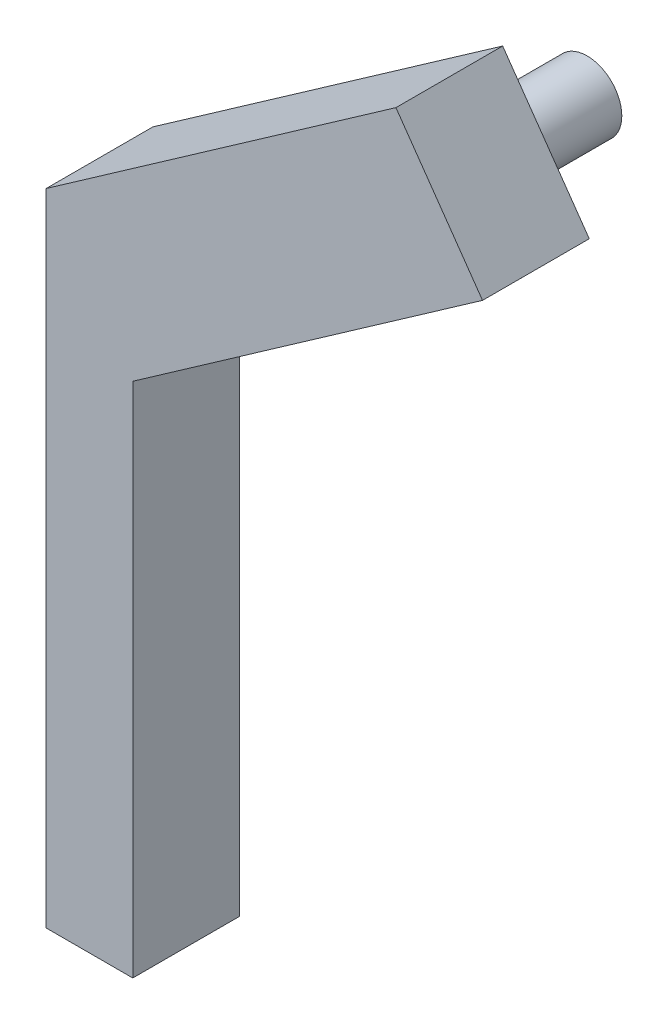
ISO-10303-21;
HEADER;
FILE_DESCRIPTION(('STEP AP214'),'2;1');
FILE_NAME('part.step','',(''),(''),'','','');
FILE_SCHEMA(('AUTOMOTIVE_DESIGN { 1 0 10303 214 1 1 1 1 }'));
ENDSEC;
DATA;
#1=APPLICATION_CONTEXT('core data for automotive mechanical design processes');
#2=APPLICATION_PROTOCOL_DEFINITION('international standard','automotive_design',2000,#1);
#3=PRODUCT_CONTEXT('',#1,'mechanical');
#4=PRODUCT('Part','Part','',(#3));
#5=PRODUCT_RELATED_PRODUCT_CATEGORY('part','',(#4));
#6=PRODUCT_DEFINITION_FORMATION('','',#4);
#7=PRODUCT_DEFINITION_CONTEXT('part definition',#1,'design');
#8=PRODUCT_DEFINITION('design','',#6,#7);
#9=PRODUCT_DEFINITION_SHAPE('','',#8);
#10=(LENGTH_UNIT() NAMED_UNIT(*) SI_UNIT(.MILLI.,.METRE.));
#11=(NAMED_UNIT(*) PLANE_ANGLE_UNIT() SI_UNIT($,.RADIAN.));
#12=(NAMED_UNIT(*) SI_UNIT($,.STERADIAN.) SOLID_ANGLE_UNIT());
#13=UNCERTAINTY_MEASURE_WITH_UNIT(LENGTH_MEASURE(1.E-05),#10,'distance_accuracy_value','');
#14=(GEOMETRIC_REPRESENTATION_CONTEXT(3) GLOBAL_UNCERTAINTY_ASSIGNED_CONTEXT((#13)) GLOBAL_UNIT_ASSIGNED_CONTEXT((#10,
#11,#12)) REPRESENTATION_CONTEXT('',''));
#15=CARTESIAN_POINT('',(0.,0.,0.));
#16=DIRECTION('',(0.,0.,1.));
#17=DIRECTION('',(1.,0.,0.));
#18=AXIS2_PLACEMENT_3D('',#15,#16,#17);
#19=CARTESIAN_POINT('',(65.6167179191911,-7.66996905929891,10.));
#20=DIRECTION('',(-0.819152044288988,-0.573576436351051,0.));
#21=DIRECTION('',(0.573576436351051,-0.819152044288988,0.));
#22=AXIS2_PLACEMENT_3D('',#19,#20,#21);
#23=PLANE('',#22);
#24=DIRECTION('',(-0.573576436351051,0.819152044288988,0.));
#25=VECTOR('',#24,1.);
#26=CARTESIAN_POINT('',(65.6167179191911,-7.66996905929891,0.));
#27=LINE('',#26,#25);
#28=CARTESIAN_POINT('',(65.6167179191911,-7.66996905929891,0.));
#29=VERTEX_POINT('',#28);
#30=CARTESIAN_POINT('',(57.5051221657382,3.91459024749248,0.));
#31=VERTEX_POINT('',#30);
#32=EDGE_CURVE('E199',#29,#31,#27,.T.);
#33=ORIENTED_EDGE('',*,*,#32,.T.);
#34=DIRECTION('',(0.,0.,-1.));
#35=VECTOR('',#34,1.);
#36=CARTESIAN_POINT('',(57.5051221657382,3.91459024749248,10.));
#37=LINE('',#36,#35);
#38=CARTESIAN_POINT('',(57.5051221657382,3.91459024749248,10.));
#39=VERTEX_POINT('',#38);
#40=EDGE_CURVE('E169',#39,#31,#37,.T.);
#41=ORIENTED_EDGE('',*,*,#40,.F.);
#42=DIRECTION('',(-0.573576436351051,0.819152044288988,0.));
#43=VECTOR('',#42,1.);
#44=CARTESIAN_POINT('',(65.6167179191911,-7.66996905929891,10.));
#45=LINE('',#44,#43);
#46=CARTESIAN_POINT('',(65.6167179191911,-7.66996905929891,10.));
#47=VERTEX_POINT('',#46);
#48=EDGE_CURVE('E185',#47,#39,#45,.T.);
#49=ORIENTED_EDGE('',*,*,#48,.F.);
#50=DIRECTION('',(0.,0.,-1.));
#51=VECTOR('',#50,1.);
#52=CARTESIAN_POINT('',(65.6167179191911,-7.66996905929891,10.));
#53=LINE('',#52,#51);
#54=EDGE_CURVE('E162',#47,#29,#53,.T.);
#55=ORIENTED_EDGE('',*,*,#54,.T.);
#56=EDGE_LOOP('',(#33,#41,#49,#55));
#57=FACE_BOUND('',#56,.T.);
#58=ADVANCED_FACE('F69',(#57),#23,.F.);
#59=CARTESIAN_POINT('',(57.5051221657382,3.91459024749248,10.));
#60=DIRECTION('',(0.57357643635105,-0.819152044288989,0.));
#61=DIRECTION('',(0.819152044288989,0.57357643635105,0.));
#62=AXIS2_PLACEMENT_3D('',#59,#60,#61);
#63=PLANE('',#62);
#64=DIRECTION('',(-0.819152044288989,-0.57357643635105,0.));
#65=VECTOR('',#64,1.);
#66=CARTESIAN_POINT('',(57.5051221657382,3.91459024749248,0.));
#67=LINE('',#66,#65);
#68=CARTESIAN_POINT('',(24.7390403941786,-19.0284672065495,0.));
#69=VERTEX_POINT('',#68);
#70=EDGE_CURVE('E202',#31,#69,#67,.T.);
#71=ORIENTED_EDGE('',*,*,#70,.T.);
#72=DIRECTION('',(0.,0.,-1.));
#73=VECTOR('',#72,1.);
#74=CARTESIAN_POINT('',(24.7390403941786,-19.0284672065495,10.));
#75=LINE('',#74,#73);
#76=CARTESIAN_POINT('',(24.7390403941786,-19.0284672065495,10.));
#77=VERTEX_POINT('',#76);
#78=EDGE_CURVE('E87',#77,#69,#75,.T.);
#79=ORIENTED_EDGE('',*,*,#78,.F.);
#80=DIRECTION('',(-0.819152044288989,-0.57357643635105,0.));
#81=VECTOR('',#80,1.);
#82=CARTESIAN_POINT('',(57.5051221657382,3.91459024749248,10.));
#83=LINE('',#82,#81);
#84=EDGE_CURVE('E182',#39,#77,#83,.T.);
#85=ORIENTED_EDGE('',*,*,#84,.F.);
#86=ORIENTED_EDGE('',*,*,#40,.T.);
#87=EDGE_LOOP('',(#71,#79,#85,#86));
#88=FACE_BOUND('',#87,.T.);
#89=ADVANCED_FACE('F205',(#88),#63,.F.);
#90=CARTESIAN_POINT('',(32.8506361476315,-30.6130265133409,10.));
#91=DIRECTION('',(-0.57357643635105,0.819152044288989,0.));
#92=DIRECTION('',(-0.819152044288989,-0.57357643635105,0.));
#93=AXIS2_PLACEMENT_3D('',#90,#91,#92);
#94=PLANE('',#93);
#95=DIRECTION('',(0.819152044288989,0.57357643635105,0.));
#96=VECTOR('',#95,1.);
#97=CARTESIAN_POINT('',(32.8506361476315,-30.6130265133409,0.));
#98=LINE('',#97,#96);
#99=CARTESIAN_POINT('',(32.8506361476315,-30.6130265133409,0.));
#100=VERTEX_POINT('',#99);
#101=EDGE_CURVE('E155',#100,#29,#98,.T.);
#102=ORIENTED_EDGE('',*,*,#101,.T.);
#103=ORIENTED_EDGE('',*,*,#54,.F.);
#104=DIRECTION('',(0.819152044288989,0.57357643635105,0.));
#105=VECTOR('',#104,1.);
#106=CARTESIAN_POINT('',(32.8506361476315,-30.6130265133409,10.));
#107=LINE('',#106,#105);
#108=CARTESIAN_POINT('',(32.8506361476315,-30.6130265133409,10.));
#109=VERTEX_POINT('',#108);
#110=EDGE_CURVE('E193',#109,#47,#107,.T.);
#111=ORIENTED_EDGE('',*,*,#110,.F.);
#112=DIRECTION('',(0.,0.,-1.));
#113=VECTOR('',#112,1.);
#114=CARTESIAN_POINT('',(32.8506361476315,-30.6130265133409,10.));
#115=LINE('',#114,#113);
#116=EDGE_CURVE('E158',#109,#100,#115,.T.);
#117=ORIENTED_EDGE('',*,*,#116,.T.);
#118=EDGE_LOOP('',(#102,#103,#111,#117));
#119=FACE_BOUND('',#118,.T.);
#120=ADVANCED_FACE('F209',(#119),#94,.F.);
#121=CARTESIAN_POINT('',(0.,0.,0.));
#122=DIRECTION('',(0.,0.,1.));
#123=DIRECTION('',(1.,0.,0.));
#124=AXIS2_PLACEMENT_3D('',#121,#122,#123);
#125=PLANE('',#124);
#126=CARTESIAN_POINT('',(55.4172797102972,-6.1795126785361,0.));
#127=DIRECTION('',(0.,0.,1.));
#128=DIRECTION('',(1.,0.,0.));
#129=AXIS2_PLACEMENT_3D('',#126,#127,#128);
#130=CIRCLE('',#129,3.25000000000001);
#131=CARTESIAN_POINT('',(58.6672797102972,-6.1795126785361,0.));
#132=VERTEX_POINT('',#131);
#133=EDGE_CURVE('E12',#132,#132,#130,.F.);
#134=ORIENTED_EDGE('',*,*,#133,.F.);
#135=EDGE_LOOP('',(#134));
#136=FACE_BOUND('',#135,.T.);
#137=CARTESIAN_POINT('',(28.7948382709051,-24.8207468599453,0.));
#138=DIRECTION('',(0.,0.,1.));
#139=DIRECTION('',(1.,0.,0.));
#140=AXIS2_PLACEMENT_3D('',#137,#138,#139);
#141=CIRCLE('',#140,3.25000000000001);
#142=CARTESIAN_POINT('',(32.0448382709051,-24.8207468599453,0.));
#143=VERTEX_POINT('',#142);
#144=EDGE_CURVE('E79',#143,#143,#141,.F.);
#145=ORIENTED_EDGE('',*,*,#144,.F.);
#146=EDGE_LOOP('',(#145));
#147=FACE_BOUND('',#146,.T.);
#148=ORIENTED_EDGE('',*,*,#101,.F.);
#149=DIRECTION('',(0.,-1.,0.));
#150=VECTOR('',#149,1.);
#151=CARTESIAN_POINT('',(32.8506361476315,-19.0284672065495,0.));
#152=LINE('',#151,#150);
#153=CARTESIAN_POINT('',(32.8506361476315,-79.0284672065495,0.));
#154=VERTEX_POINT('',#153);
#155=EDGE_CURVE('E117',#100,#154,#152,.T.);
#156=ORIENTED_EDGE('',*,*,#155,.T.);
#157=DIRECTION('',(1.,0.,0.));
#158=VECTOR('',#157,1.);
#159=CARTESIAN_POINT('',(24.7390403941786,-79.0284672065495,0.));
#160=LINE('',#159,#158);
#161=CARTESIAN_POINT('',(24.7390403941786,-79.0284672065495,0.));
#162=VERTEX_POINT('',#161);
#163=EDGE_CURVE('E135',#162,#154,#160,.T.);
#164=ORIENTED_EDGE('',*,*,#163,.F.);
#165=DIRECTION('',(0.,-1.,0.));
#166=VECTOR('',#165,1.);
#167=CARTESIAN_POINT('',(24.7390403941786,-19.0284672065495,0.));
#168=LINE('',#167,#166);
#169=EDGE_CURVE('E123',#69,#162,#168,.T.);
#170=ORIENTED_EDGE('',*,*,#169,.F.);
#171=ORIENTED_EDGE('',*,*,#70,.F.);
#172=ORIENTED_EDGE('',*,*,#32,.F.);
#173=EDGE_LOOP('',(#148,#156,#164,#170,#171,#172));
#174=FACE_BOUND('',#173,.T.);
#175=ADVANCED_FACE('F141',(#136,#147,#174),#125,.F.);
#176=CARTESIAN_POINT('',(0.,0.,10.));
#177=DIRECTION('',(0.,0.,1.));
#178=DIRECTION('',(1.,0.,0.));
#179=AXIS2_PLACEMENT_3D('',#176,#177,#178);
#180=PLANE('',#179);
#181=ORIENTED_EDGE('',*,*,#84,.T.);
#182=DIRECTION('',(0.,-1.,0.));
#183=VECTOR('',#182,1.);
#184=CARTESIAN_POINT('',(24.7390403941786,-19.0284672065495,10.));
#185=LINE('',#184,#183);
#186=CARTESIAN_POINT('',(24.7390403941786,-79.0284672065495,10.));
#187=VERTEX_POINT('',#186);
#188=EDGE_CURVE('E139',#77,#187,#185,.T.);
#189=ORIENTED_EDGE('',*,*,#188,.T.);
#190=DIRECTION('',(1.,0.,0.));
#191=VECTOR('',#190,1.);
#192=CARTESIAN_POINT('',(24.7390403941786,-79.0284672065495,10.));
#193=LINE('',#192,#191);
#194=CARTESIAN_POINT('',(32.8506361476315,-79.0284672065495,10.));
#195=VERTEX_POINT('',#194);
#196=EDGE_CURVE('E130',#187,#195,#193,.T.);
#197=ORIENTED_EDGE('',*,*,#196,.T.);
#198=DIRECTION('',(0.,-1.,0.));
#199=VECTOR('',#198,1.);
#200=CARTESIAN_POINT('',(32.8506361476315,-19.0284672065495,10.));
#201=LINE('',#200,#199);
#202=EDGE_CURVE('E174',#109,#195,#201,.T.);
#203=ORIENTED_EDGE('',*,*,#202,.F.);
#204=ORIENTED_EDGE('',*,*,#110,.T.);
#205=ORIENTED_EDGE('',*,*,#48,.T.);
#206=EDGE_LOOP('',(#181,#189,#197,#203,#204,#205));
#207=FACE_BOUND('',#206,.T.);
#208=ADVANCED_FACE('F181',(#207),#180,.T.);
#209=CARTESIAN_POINT('',(24.7390403941786,-79.0284672065495,10.));
#210=DIRECTION('',(0.,1.,0.));
#211=DIRECTION('',(0.,0.,1.));
#212=AXIS2_PLACEMENT_3D('',#209,#210,#211);
#213=PLANE('',#212);
#214=ORIENTED_EDGE('',*,*,#163,.T.);
#215=DIRECTION('',(0.,0.,-1.));
#216=VECTOR('',#215,1.);
#217=CARTESIAN_POINT('',(32.8506361476315,-79.0284672065495,10.));
#218=LINE('',#217,#216);
#219=EDGE_CURVE('E138',#195,#154,#218,.T.);
#220=ORIENTED_EDGE('',*,*,#219,.F.);
#221=ORIENTED_EDGE('',*,*,#196,.F.);
#222=DIRECTION('',(0.,0.,-1.));
#223=VECTOR('',#222,1.);
#224=CARTESIAN_POINT('',(24.7390403941786,-79.0284672065495,10.));
#225=LINE('',#224,#223);
#226=EDGE_CURVE('E126',#187,#162,#225,.T.);
#227=ORIENTED_EDGE('',*,*,#226,.T.);
#228=EDGE_LOOP('',(#214,#220,#221,#227));
#229=FACE_BOUND('',#228,.T.);
#230=ADVANCED_FACE('F71',(#229),#213,.F.);
#231=CARTESIAN_POINT('',(24.7390403941786,-19.0284672065495,10.));
#232=DIRECTION('',(1.,0.,0.));
#233=DIRECTION('',(0.,1.,0.));
#234=AXIS2_PLACEMENT_3D('',#231,#232,#233);
#235=PLANE('',#234);
#236=ORIENTED_EDGE('',*,*,#169,.T.);
#237=ORIENTED_EDGE('',*,*,#226,.F.);
#238=ORIENTED_EDGE('',*,*,#188,.F.);
#239=ORIENTED_EDGE('',*,*,#78,.T.);
#240=EDGE_LOOP('',(#236,#237,#238,#239));
#241=FACE_BOUND('',#240,.T.);
#242=ADVANCED_FACE('F125',(#241),#235,.F.);
#243=CARTESIAN_POINT('',(32.8506361476315,-19.0284672065495,10.));
#244=DIRECTION('',(1.,0.,0.));
#245=DIRECTION('',(0.,1.,0.));
#246=AXIS2_PLACEMENT_3D('',#243,#244,#245);
#247=PLANE('',#246);
#248=ORIENTED_EDGE('',*,*,#116,.F.);
#249=ORIENTED_EDGE('',*,*,#202,.T.);
#250=ORIENTED_EDGE('',*,*,#219,.T.);
#251=ORIENTED_EDGE('',*,*,#155,.F.);
#252=EDGE_LOOP('',(#248,#249,#250,#251));
#253=FACE_BOUND('',#252,.T.);
#254=ADVANCED_FACE('F211',(#253),#247,.T.);
#255=CARTESIAN_POINT('',(28.7948382709051,-24.8207468599453,-10.));
#256=DIRECTION('',(0.,0.,1.));
#257=DIRECTION('',(1.,0.,0.));
#258=AXIS2_PLACEMENT_3D('',#255,#256,#257);
#259=CYLINDRICAL_SURFACE('',#258,3.25000000000001);
#260=CARTESIAN_POINT('',(28.7948382709051,-24.8207468599453,-10.));
#261=DIRECTION('',(0.,0.,-1.));
#262=DIRECTION('',(-1.,0.,0.));
#263=AXIS2_PLACEMENT_3D('',#260,#261,#262);
#264=CIRCLE('',#263,3.25000000000001);
#265=CARTESIAN_POINT('',(25.5448382709051,-24.8207468599453,-10.));
#266=VERTEX_POINT('',#265);
#267=EDGE_CURVE('E149',#266,#266,#264,.T.);
#268=ORIENTED_EDGE('',*,*,#267,.F.);
#269=EDGE_LOOP('',(#268));
#270=FACE_BOUND('',#269,.T.);
#271=ORIENTED_EDGE('',*,*,#144,.T.);
#272=EDGE_LOOP('',(#271));
#273=FACE_BOUND('',#272,.T.);
#274=ADVANCED_FACE('F213',(#270,#273),#259,.T.);
#275=CARTESIAN_POINT('',(28.7948382709051,-24.8207468599453,-10.));
#276=DIRECTION('',(0.,0.,-1.));
#277=DIRECTION('',(-1.,0.,0.));
#278=AXIS2_PLACEMENT_3D('',#275,#276,#277);
#279=PLANE('',#278);
#280=ORIENTED_EDGE('',*,*,#267,.T.);
#281=EDGE_LOOP('',(#280));
#282=FACE_BOUND('',#281,.T.);
#283=ADVANCED_FACE('F219',(#282),#279,.T.);
#284=CARTESIAN_POINT('',(55.4172797102972,-6.1795126785361,-10.));
#285=DIRECTION('',(0.,0.,1.));
#286=DIRECTION('',(1.,0.,0.));
#287=AXIS2_PLACEMENT_3D('',#284,#285,#286);
#288=CYLINDRICAL_SURFACE('',#287,3.25000000000001);
#289=CARTESIAN_POINT('',(55.4172797102972,-6.1795126785361,-10.));
#290=DIRECTION('',(0.,0.,-1.));
#291=DIRECTION('',(-1.,0.,0.));
#292=AXIS2_PLACEMENT_3D('',#289,#290,#291);
#293=CIRCLE('',#292,3.25000000000001);
#294=CARTESIAN_POINT('',(52.1672797102972,-6.1795126785361,-10.));
#295=VERTEX_POINT('',#294);
#296=EDGE_CURVE('E143',#295,#295,#293,.T.);
#297=ORIENTED_EDGE('',*,*,#296,.F.);
#298=EDGE_LOOP('',(#297));
#299=FACE_BOUND('',#298,.T.);
#300=ORIENTED_EDGE('',*,*,#133,.T.);
#301=EDGE_LOOP('',(#300));
#302=FACE_BOUND('',#301,.T.);
#303=ADVANCED_FACE('F244',(#299,#302),#288,.T.);
#304=CARTESIAN_POINT('',(55.4172797102972,-6.1795126785361,-10.));
#305=DIRECTION('',(0.,0.,-1.));
#306=DIRECTION('',(-1.,0.,0.));
#307=AXIS2_PLACEMENT_3D('',#304,#305,#306);
#308=PLANE('',#307);
#309=ORIENTED_EDGE('',*,*,#296,.T.);
#310=EDGE_LOOP('',(#309));
#311=FACE_BOUND('',#310,.T.);
#312=ADVANCED_FACE('F249',(#311),#308,.T.);
#313=CLOSED_SHELL('',(#58,#89,#120,#175,#208,#230,#242,#254,#274,#283,#303,#312));
#314=MANIFOLD_SOLID_BREP('B2',#313);
#315=ADVANCED_BREP_SHAPE_REPRESENTATION('',(#18,#314),#14);
#316=SHAPE_DEFINITION_REPRESENTATION(#9,#315);
ENDSEC;
END-ISO-10303-21;
